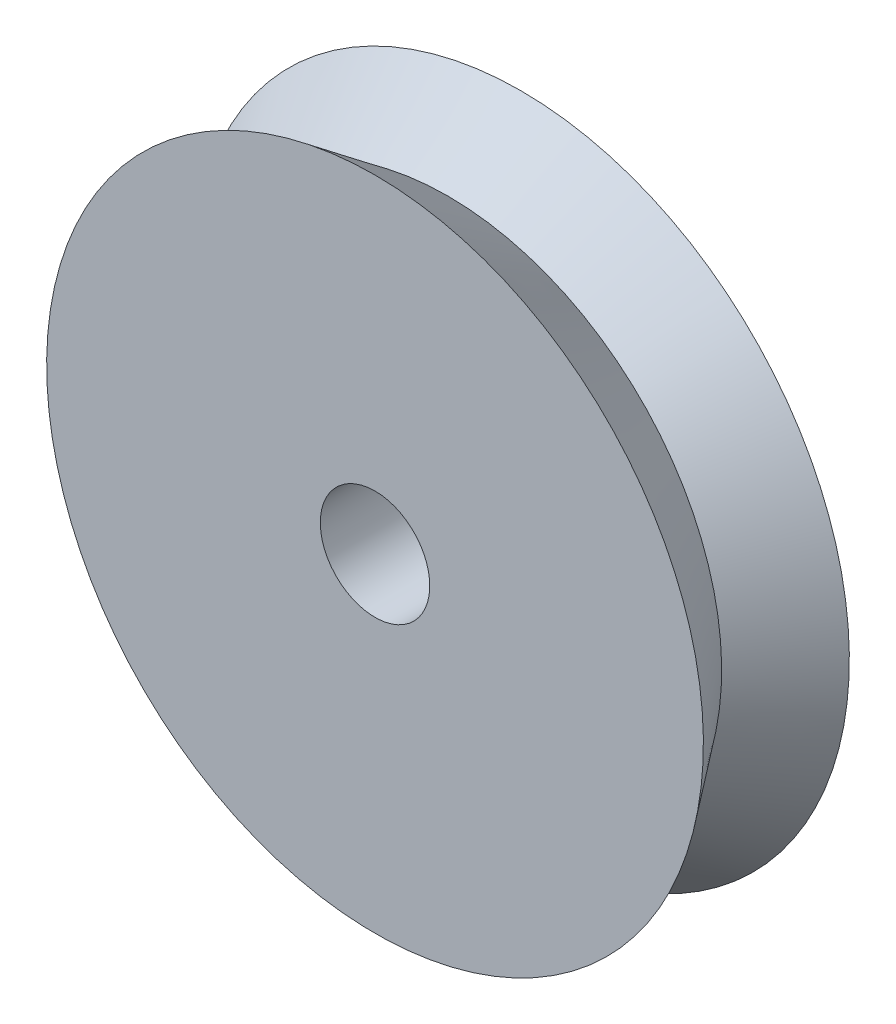
ISO-10303-21;
HEADER;
FILE_DESCRIPTION(('STEP AP214'),'2;1');
FILE_NAME('part.step','',(''),(''),'','','');
FILE_SCHEMA(('AUTOMOTIVE_DESIGN { 1 0 10303 214 1 1 1 1 }'));
ENDSEC;
DATA;
#1=APPLICATION_CONTEXT('core data for automotive mechanical design processes');
#2=APPLICATION_PROTOCOL_DEFINITION('international standard','automotive_design',2000,#1);
#3=PRODUCT_CONTEXT('',#1,'mechanical');
#4=PRODUCT('Part','Part','',(#3));
#5=PRODUCT_RELATED_PRODUCT_CATEGORY('part','',(#4));
#6=PRODUCT_DEFINITION_FORMATION('','',#4);
#7=PRODUCT_DEFINITION_CONTEXT('part definition',#1,'design');
#8=PRODUCT_DEFINITION('design','',#6,#7);
#9=PRODUCT_DEFINITION_SHAPE('','',#8);
#10=(LENGTH_UNIT() NAMED_UNIT(*) SI_UNIT(.MILLI.,.METRE.));
#11=(NAMED_UNIT(*) PLANE_ANGLE_UNIT() SI_UNIT($,.RADIAN.));
#12=(NAMED_UNIT(*) SI_UNIT($,.STERADIAN.) SOLID_ANGLE_UNIT());
#13=UNCERTAINTY_MEASURE_WITH_UNIT(LENGTH_MEASURE(1.E-05),#10,'distance_accuracy_value','');
#14=(GEOMETRIC_REPRESENTATION_CONTEXT(3) GLOBAL_UNCERTAINTY_ASSIGNED_CONTEXT((#13)) GLOBAL_UNIT_ASSIGNED_CONTEXT((#10,
#11,#12)) REPRESENTATION_CONTEXT('',''));
#15=CARTESIAN_POINT('',(0.,0.,0.));
#16=DIRECTION('',(0.,0.,1.));
#17=DIRECTION('',(1.,0.,0.));
#18=AXIS2_PLACEMENT_3D('',#15,#16,#17);
#19=CARTESIAN_POINT('',(0.,0.,0.));
#20=DIRECTION('',(0.,0.,-1.));
#21=DIRECTION('',(0.,1.,0.));
#22=AXIS2_PLACEMENT_3D('',#19,#20,#21);
#23=CONICAL_SURFACE('',#22,9.,0.643501108793);
#24=CARTESIAN_POINT('',(0.,0.,2.00000000000043));
#25=DIRECTION('',(0.,0.,-1.));
#26=DIRECTION('',(0.,1.,0.));
#27=AXIS2_PLACEMENT_3D('',#24,#25,#26);
#28=CIRCLE('',#27,7.50000000000057);
#29=CARTESIAN_POINT('',(0.,7.50000000000057,2.00000000000042));
#30=VERTEX_POINT('',#29);
#31=EDGE_CURVE('E10',#30,#30,#28,.T.);
#32=ORIENTED_EDGE('',*,*,#31,.T.);
#33=EDGE_LOOP('',(#32));
#34=FACE_BOUND('',#33,.T.);
#35=CARTESIAN_POINT('',(0.,0.,0.));
#36=DIRECTION('',(0.,0.,-1.));
#37=DIRECTION('',(0.,1.,0.));
#38=AXIS2_PLACEMENT_3D('',#35,#36,#37);
#39=CIRCLE('',#38,9.);
#40=CARTESIAN_POINT('',(0.,9.,0.));
#41=VERTEX_POINT('',#40);
#42=EDGE_CURVE('E52',#41,#41,#39,.T.);
#43=ORIENTED_EDGE('',*,*,#42,.F.);
#44=EDGE_LOOP('',(#43));
#45=FACE_BOUND('',#44,.T.);
#46=ADVANCED_FACE('F33',(#34,#45),#23,.T.);
#47=CARTESIAN_POINT('',(0.,0.,2.00000000000043));
#48=DIRECTION('',(0.,0.,1.));
#49=DIRECTION('',(0.,-1.,0.));
#50=AXIS2_PLACEMENT_3D('',#47,#48,#49);
#51=CONICAL_SURFACE('',#50,7.50000000000057,0.64350110879292);
#52=CARTESIAN_POINT('',(0.,0.,4.00000000000043));
#53=DIRECTION('',(0.,0.,-1.));
#54=DIRECTION('',(0.,1.,0.));
#55=AXIS2_PLACEMENT_3D('',#52,#53,#54);
#56=CIRCLE('',#55,8.99999999999943);
#57=CARTESIAN_POINT('',(0.,8.99999999999944,4.00000000000042));
#58=VERTEX_POINT('',#57);
#59=EDGE_CURVE('E39',#58,#58,#56,.T.);
#60=ORIENTED_EDGE('',*,*,#59,.T.);
#61=EDGE_LOOP('',(#60));
#62=FACE_BOUND('',#61,.T.);
#63=ORIENTED_EDGE('',*,*,#31,.F.);
#64=EDGE_LOOP('',(#63));
#65=FACE_BOUND('',#64,.T.);
#66=ADVANCED_FACE('F60',(#62,#65),#51,.T.);
#67=CARTESIAN_POINT('',(8.99999999999943,0.,4.00000000000043));
#68=DIRECTION('',(0.,0.,1.));
#69=DIRECTION('',(0.,-1.,0.));
#70=AXIS2_PLACEMENT_3D('',#67,#68,#69);
#71=PLANE('',#70);
#72=CARTESIAN_POINT('',(0.,0.,4.00000000000043));
#73=DIRECTION('',(0.,0.,-1.));
#74=DIRECTION('',(0.,1.,0.));
#75=AXIS2_PLACEMENT_3D('',#72,#73,#74);
#76=CIRCLE('',#75,1.5);
#77=CARTESIAN_POINT('',(0.,1.5,4.00000000000043));
#78=VERTEX_POINT('',#77);
#79=EDGE_CURVE('E43',#78,#78,#76,.T.);
#80=ORIENTED_EDGE('',*,*,#79,.T.);
#81=EDGE_LOOP('',(#80));
#82=FACE_BOUND('',#81,.T.);
#83=ORIENTED_EDGE('',*,*,#59,.F.);
#84=EDGE_LOOP('',(#83));
#85=FACE_BOUND('',#84,.T.);
#86=ADVANCED_FACE('F64',(#82,#85),#71,.T.);
#87=CARTESIAN_POINT('',(0.,0.,4.00000000000043));
#88=DIRECTION('',(0.,0.,-1.));
#89=DIRECTION('',(0.,1.,0.));
#90=AXIS2_PLACEMENT_3D('',#87,#88,#89);
#91=CYLINDRICAL_SURFACE('',#90,1.5);
#92=CARTESIAN_POINT('',(0.,0.,0.));
#93=DIRECTION('',(0.,0.,-1.));
#94=DIRECTION('',(0.,1.,0.));
#95=AXIS2_PLACEMENT_3D('',#92,#93,#94);
#96=CIRCLE('',#95,1.5);
#97=CARTESIAN_POINT('',(0.,1.5,0.));
#98=VERTEX_POINT('',#97);
#99=EDGE_CURVE('E47',#98,#98,#96,.T.);
#100=ORIENTED_EDGE('',*,*,#99,.T.);
#101=EDGE_LOOP('',(#100));
#102=FACE_BOUND('',#101,.T.);
#103=ORIENTED_EDGE('',*,*,#79,.F.);
#104=EDGE_LOOP('',(#103));
#105=FACE_BOUND('',#104,.T.);
#106=ADVANCED_FACE('F68',(#102,#105),#91,.F.);
#107=CARTESIAN_POINT('',(1.5,0.,0.));
#108=DIRECTION('',(0.,0.,-1.));
#109=DIRECTION('',(0.,1.,0.));
#110=AXIS2_PLACEMENT_3D('',#107,#108,#109);
#111=PLANE('',#110);
#112=ORIENTED_EDGE('',*,*,#42,.T.);
#113=EDGE_LOOP('',(#112));
#114=FACE_BOUND('',#113,.T.);
#115=ORIENTED_EDGE('',*,*,#99,.F.);
#116=EDGE_LOOP('',(#115));
#117=FACE_BOUND('',#116,.T.);
#118=ADVANCED_FACE('F56',(#114,#117),#111,.T.);
#119=CLOSED_SHELL('',(#46,#66,#86,#106,#118));
#120=MANIFOLD_SOLID_BREP('B2',#119);
#121=ADVANCED_BREP_SHAPE_REPRESENTATION('',(#18,#120),#14);
#122=SHAPE_DEFINITION_REPRESENTATION(#9,#121);
ENDSEC;
END-ISO-10303-21;
